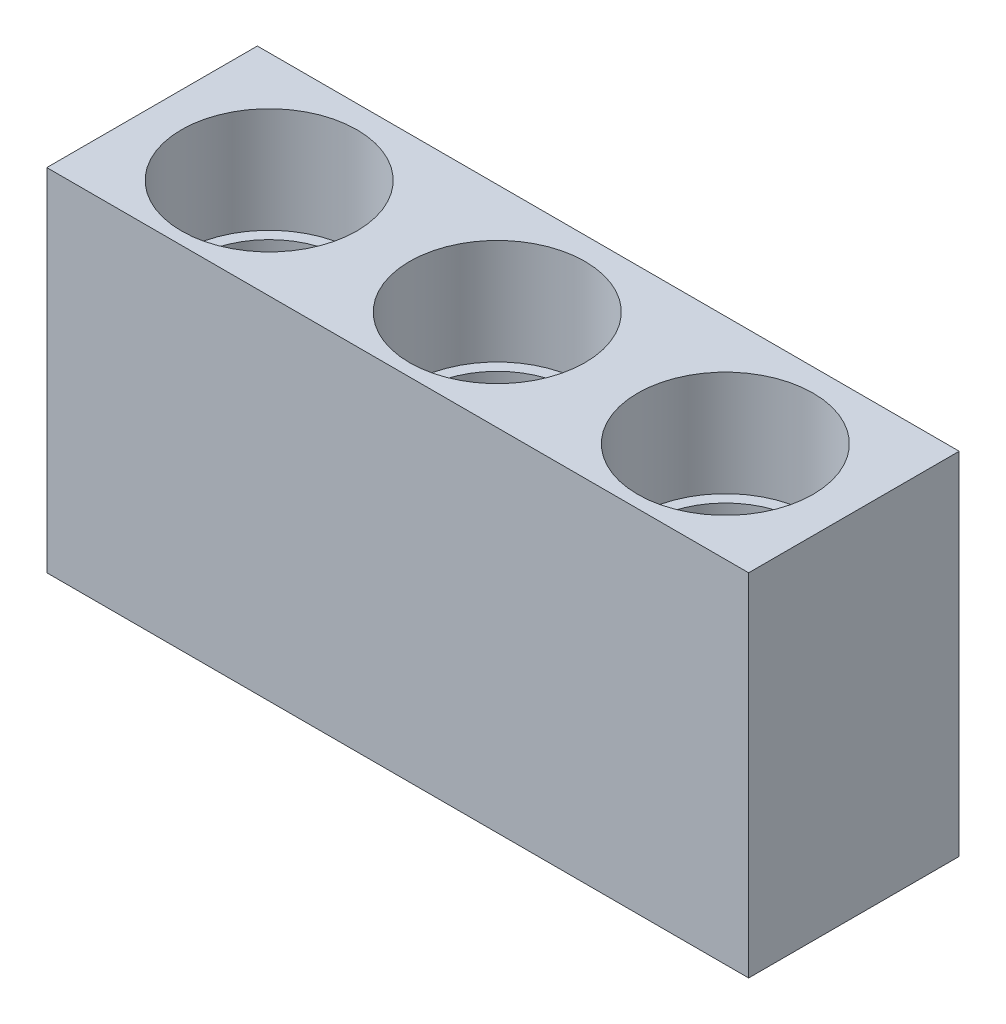
ISO-10303-21;
HEADER;
FILE_DESCRIPTION(('STEP AP214'),'2;1');
FILE_NAME('part.step','',(''),(''),'','','');
FILE_SCHEMA(('AUTOMOTIVE_DESIGN { 1 0 10303 214 1 1 1 1 }'));
ENDSEC;
DATA;
#1=APPLICATION_CONTEXT('core data for automotive mechanical design processes');
#2=APPLICATION_PROTOCOL_DEFINITION('international standard','automotive_design',2000,#1);
#3=PRODUCT_CONTEXT('',#1,'mechanical');
#4=PRODUCT('Part','Part','',(#3));
#5=PRODUCT_RELATED_PRODUCT_CATEGORY('part','',(#4));
#6=PRODUCT_DEFINITION_FORMATION('','',#4);
#7=PRODUCT_DEFINITION_CONTEXT('part definition',#1,'design');
#8=PRODUCT_DEFINITION('design','',#6,#7);
#9=PRODUCT_DEFINITION_SHAPE('','',#8);
#10=(LENGTH_UNIT() NAMED_UNIT(*) SI_UNIT(.MILLI.,.METRE.));
#11=(NAMED_UNIT(*) PLANE_ANGLE_UNIT() SI_UNIT($,.RADIAN.));
#12=(NAMED_UNIT(*) SI_UNIT($,.STERADIAN.) SOLID_ANGLE_UNIT());
#13=UNCERTAINTY_MEASURE_WITH_UNIT(LENGTH_MEASURE(1.E-05),#10,'distance_accuracy_value','');
#14=(GEOMETRIC_REPRESENTATION_CONTEXT(3) GLOBAL_UNCERTAINTY_ASSIGNED_CONTEXT((#13)) GLOBAL_UNIT_ASSIGNED_CONTEXT((#10,
#11,#12)) REPRESENTATION_CONTEXT('',''));
#15=CARTESIAN_POINT('',(0.,0.,0.));
#16=DIRECTION('',(0.,0.,1.));
#17=DIRECTION('',(1.,0.,0.));
#18=AXIS2_PLACEMENT_3D('',#15,#16,#17);
#19=CARTESIAN_POINT('',(6.48366053627173,-3.,-2.85305067871366));
#20=DIRECTION('',(0.,1.,0.));
#21=DIRECTION('',(0.,0.,1.));
#22=AXIS2_PLACEMENT_3D('',#19,#20,#21);
#23=PLANE('',#22);
#24=CARTESIAN_POINT('',(6.48366053627173,-3.,-2.85305067871366));
#25=DIRECTION('',(0.,1.,0.));
#26=DIRECTION('',(0.,0.,1.));
#27=AXIS2_PLACEMENT_3D('',#24,#25,#26);
#28=CIRCLE('',#27,2.175);
#29=CARTESIAN_POINT('',(6.48366053627173,-3.,-0.678050678713657));
#30=VERTEX_POINT('',#29);
#31=EDGE_CURVE('E12',#30,#30,#28,.T.);
#32=ORIENTED_EDGE('',*,*,#31,.T.);
#33=EDGE_LOOP('',(#32));
#34=FACE_BOUND('',#33,.T.);
#35=ADVANCED_FACE('F64',(#34),#23,.T.);
#36=CARTESIAN_POINT('',(6.48366053627173,-3.,-2.85305067871366));
#37=DIRECTION('',(0.,1.,0.));
#38=DIRECTION('',(0.,0.,1.));
#39=AXIS2_PLACEMENT_3D('',#36,#37,#38);
#40=CYLINDRICAL_SURFACE('',#39,2.175);
#41=ORIENTED_EDGE('',*,*,#31,.F.);
#42=EDGE_LOOP('',(#41));
#43=FACE_BOUND('',#42,.T.);
#44=CARTESIAN_POINT('',(6.48366053627173,2.,-2.85305067871366));
#45=DIRECTION('',(0.,1.,0.));
#46=DIRECTION('',(0.,0.,1.));
#47=AXIS2_PLACEMENT_3D('',#44,#45,#46);
#48=CIRCLE('',#47,2.175);
#49=CARTESIAN_POINT('',(6.48366053627173,2.,-0.678050678713657));
#50=VERTEX_POINT('',#49);
#51=EDGE_CURVE('E72',#50,#50,#48,.T.);
#52=ORIENTED_EDGE('',*,*,#51,.T.);
#53=EDGE_LOOP('',(#52));
#54=FACE_BOUND('',#53,.T.);
#55=ADVANCED_FACE('F146',(#43,#54),#40,.F.);
#56=CARTESIAN_POINT('',(6.48366053627173,2.,-2.85305067871366));
#57=DIRECTION('',(0.,1.,0.));
#58=DIRECTION('',(0.,0.,1.));
#59=AXIS2_PLACEMENT_3D('',#56,#57,#58);
#60=PLANE('',#59);
#61=ORIENTED_EDGE('',*,*,#51,.F.);
#62=EDGE_LOOP('',(#61));
#63=FACE_BOUND('',#62,.T.);
#64=CARTESIAN_POINT('',(6.48366053627173,2.,-2.85305067871366));
#65=DIRECTION('',(0.,1.,0.));
#66=DIRECTION('',(0.,0.,1.));
#67=AXIS2_PLACEMENT_3D('',#64,#65,#66);
#68=CIRCLE('',#67,2.5);
#69=CARTESIAN_POINT('',(6.48366053627173,2.,-0.353050678713656));
#70=VERTEX_POINT('',#69);
#71=EDGE_CURVE('E143',#70,#70,#68,.T.);
#72=ORIENTED_EDGE('',*,*,#71,.T.);
#73=EDGE_LOOP('',(#72));
#74=FACE_BOUND('',#73,.T.);
#75=ADVANCED_FACE('F147',(#63,#74),#60,.T.);
#76=CARTESIAN_POINT('',(6.48366053627173,2.,-2.85305067871366));
#77=DIRECTION('',(0.,1.,0.));
#78=DIRECTION('',(0.,0.,1.));
#79=AXIS2_PLACEMENT_3D('',#76,#77,#78);
#80=CYLINDRICAL_SURFACE('',#79,2.5);
#81=ORIENTED_EDGE('',*,*,#71,.F.);
#82=EDGE_LOOP('',(#81));
#83=FACE_BOUND('',#82,.T.);
#84=CARTESIAN_POINT('',(6.48366053627173,5.,-2.85305067871366));
#85=DIRECTION('',(0.,1.,0.));
#86=DIRECTION('',(0.,0.,1.));
#87=AXIS2_PLACEMENT_3D('',#84,#85,#86);
#88=CIRCLE('',#87,2.5);
#89=CARTESIAN_POINT('',(6.48366053627173,5.,-0.353050678713656));
#90=VERTEX_POINT('',#89);
#91=EDGE_CURVE('E132',#90,#90,#88,.T.);
#92=ORIENTED_EDGE('',*,*,#91,.T.);
#93=EDGE_LOOP('',(#92));
#94=FACE_BOUND('',#93,.T.);
#95=ADVANCED_FACE('F153',(#83,#94),#80,.F.);
#96=CARTESIAN_POINT('',(0.,5.,0.));
#97=DIRECTION('',(0.,0.,-1.));
#98=DIRECTION('',(-1.,0.,0.));
#99=AXIS2_PLACEMENT_3D('',#96,#97,#98);
#100=PLANE('',#99);
#101=DIRECTION('',(1.,0.,0.));
#102=VECTOR('',#101,1.);
#103=CARTESIAN_POINT('',(0.,-5.,0.));
#104=LINE('',#103,#102);
#105=CARTESIAN_POINT('',(-10.,-5.,0.));
#106=VERTEX_POINT('',#105);
#107=CARTESIAN_POINT('',(10.,-5.,0.));
#108=VERTEX_POINT('',#107);
#109=EDGE_CURVE('E126',#106,#108,#104,.T.);
#110=ORIENTED_EDGE('',*,*,#109,.T.);
#111=DIRECTION('',(0.,-1.,0.));
#112=VECTOR('',#111,1.);
#113=CARTESIAN_POINT('',(10.,5.,0.));
#114=LINE('',#113,#112);
#115=CARTESIAN_POINT('',(10.,5.,0.));
#116=VERTEX_POINT('',#115);
#117=EDGE_CURVE('E112',#116,#108,#114,.T.);
#118=ORIENTED_EDGE('',*,*,#117,.F.);
#119=DIRECTION('',(1.,0.,0.));
#120=VECTOR('',#119,1.);
#121=CARTESIAN_POINT('',(0.,5.,0.));
#122=LINE('',#121,#120);
#123=CARTESIAN_POINT('',(-10.,5.,0.));
#124=VERTEX_POINT('',#123);
#125=EDGE_CURVE('E119',#124,#116,#122,.T.);
#126=ORIENTED_EDGE('',*,*,#125,.F.);
#127=DIRECTION('',(0.,-1.,0.));
#128=VECTOR('',#127,1.);
#129=CARTESIAN_POINT('',(-10.,5.,0.));
#130=LINE('',#129,#128);
#131=EDGE_CURVE('E105',#124,#106,#130,.T.);
#132=ORIENTED_EDGE('',*,*,#131,.T.);
#133=EDGE_LOOP('',(#110,#118,#126,#132));
#134=FACE_BOUND('',#133,.T.);
#135=ADVANCED_FACE('F127',(#134),#100,.F.);
#136=CARTESIAN_POINT('',(10.,5.,0.));
#137=DIRECTION('',(-1.,0.,0.));
#138=DIRECTION('',(0.,0.,1.));
#139=AXIS2_PLACEMENT_3D('',#136,#137,#138);
#140=PLANE('',#139);
#141=DIRECTION('',(0.,0.,-1.));
#142=VECTOR('',#141,1.);
#143=CARTESIAN_POINT('',(10.,-5.,0.));
#144=LINE('',#143,#142);
#145=CARTESIAN_POINT('',(10.,-5.,-6.));
#146=VERTEX_POINT('',#145);
#147=EDGE_CURVE('E201',#108,#146,#144,.T.);
#148=ORIENTED_EDGE('',*,*,#147,.T.);
#149=DIRECTION('',(0.,-1.,0.));
#150=VECTOR('',#149,1.);
#151=CARTESIAN_POINT('',(10.,5.,-6.));
#152=LINE('',#151,#150);
#153=CARTESIAN_POINT('',(10.,5.,-6.));
#154=VERTEX_POINT('',#153);
#155=EDGE_CURVE('E94',#154,#146,#152,.T.);
#156=ORIENTED_EDGE('',*,*,#155,.F.);
#157=DIRECTION('',(0.,0.,-1.));
#158=VECTOR('',#157,1.);
#159=CARTESIAN_POINT('',(10.,5.,0.));
#160=LINE('',#159,#158);
#161=EDGE_CURVE('E110',#116,#154,#160,.T.);
#162=ORIENTED_EDGE('',*,*,#161,.F.);
#163=ORIENTED_EDGE('',*,*,#117,.T.);
#164=EDGE_LOOP('',(#148,#156,#162,#163));
#165=FACE_BOUND('',#164,.T.);
#166=ADVANCED_FACE('F108',(#165),#140,.F.);
#167=CARTESIAN_POINT('',(0.,5.,-6.));
#168=DIRECTION('',(0.,0.,-1.));
#169=DIRECTION('',(-1.,0.,0.));
#170=AXIS2_PLACEMENT_3D('',#167,#168,#169);
#171=PLANE('',#170);
#172=DIRECTION('',(1.,0.,0.));
#173=VECTOR('',#172,1.);
#174=CARTESIAN_POINT('',(0.,-5.,-6.));
#175=LINE('',#174,#173);
#176=CARTESIAN_POINT('',(-10.,-5.,-6.));
#177=VERTEX_POINT('',#176);
#178=EDGE_CURVE('E203',#177,#146,#175,.T.);
#179=ORIENTED_EDGE('',*,*,#178,.F.);
#180=DIRECTION('',(0.,-1.,0.));
#181=VECTOR('',#180,1.);
#182=CARTESIAN_POINT('',(-10.,5.,-6.));
#183=LINE('',#182,#181);
#184=CARTESIAN_POINT('',(-10.,5.,-6.));
#185=VERTEX_POINT('',#184);
#186=EDGE_CURVE('E80',#185,#177,#183,.T.);
#187=ORIENTED_EDGE('',*,*,#186,.F.);
#188=DIRECTION('',(1.,0.,0.));
#189=VECTOR('',#188,1.);
#190=CARTESIAN_POINT('',(0.,5.,-6.));
#191=LINE('',#190,#189);
#192=EDGE_CURVE('E118',#185,#154,#191,.T.);
#193=ORIENTED_EDGE('',*,*,#192,.T.);
#194=ORIENTED_EDGE('',*,*,#155,.T.);
#195=EDGE_LOOP('',(#179,#187,#193,#194));
#196=FACE_BOUND('',#195,.T.);
#197=ADVANCED_FACE('F195',(#196),#171,.T.);
#198=CARTESIAN_POINT('',(-10.,5.,0.));
#199=DIRECTION('',(-1.,0.,0.));
#200=DIRECTION('',(0.,0.,1.));
#201=AXIS2_PLACEMENT_3D('',#198,#199,#200);
#202=PLANE('',#201);
#203=DIRECTION('',(0.,0.,-1.));
#204=VECTOR('',#203,1.);
#205=CARTESIAN_POINT('',(-10.,-5.,0.));
#206=LINE('',#205,#204);
#207=EDGE_CURVE('E212',#106,#177,#206,.T.);
#208=ORIENTED_EDGE('',*,*,#207,.F.);
#209=ORIENTED_EDGE('',*,*,#131,.F.);
#210=DIRECTION('',(0.,0.,-1.));
#211=VECTOR('',#210,1.);
#212=CARTESIAN_POINT('',(-10.,5.,0.));
#213=LINE('',#212,#211);
#214=EDGE_CURVE('E125',#124,#185,#213,.T.);
#215=ORIENTED_EDGE('',*,*,#214,.T.);
#216=ORIENTED_EDGE('',*,*,#186,.T.);
#217=EDGE_LOOP('',(#208,#209,#215,#216));
#218=FACE_BOUND('',#217,.T.);
#219=ADVANCED_FACE('F175',(#218),#202,.T.);
#220=CARTESIAN_POINT('',(0.,-5.,0.));
#221=DIRECTION('',(0.,1.,0.));
#222=DIRECTION('',(0.,0.,1.));
#223=AXIS2_PLACEMENT_3D('',#220,#221,#222);
#224=PLANE('',#223);
#225=ORIENTED_EDGE('',*,*,#207,.T.);
#226=ORIENTED_EDGE('',*,*,#178,.T.);
#227=ORIENTED_EDGE('',*,*,#147,.F.);
#228=ORIENTED_EDGE('',*,*,#109,.F.);
#229=EDGE_LOOP('',(#225,#226,#227,#228));
#230=FACE_BOUND('',#229,.T.);
#231=ADVANCED_FACE('F162',(#230),#224,.F.);
#232=CARTESIAN_POINT('',(0.,5.,0.));
#233=DIRECTION('',(0.,1.,0.));
#234=DIRECTION('',(0.,0.,1.));
#235=AXIS2_PLACEMENT_3D('',#232,#233,#234);
#236=PLANE('',#235);
#237=CARTESIAN_POINT('',(-0.0163394637282674,5.,-2.85305067871366));
#238=DIRECTION('',(0.,1.,0.));
#239=DIRECTION('',(0.,0.,1.));
#240=AXIS2_PLACEMENT_3D('',#237,#238,#239);
#241=CIRCLE('',#240,2.5);
#242=CARTESIAN_POINT('',(-0.0163394637282674,5.,-0.353050678713656));
#243=VERTEX_POINT('',#242);
#244=EDGE_CURVE('E241',#243,#243,#241,.T.);
#245=ORIENTED_EDGE('',*,*,#244,.F.);
#246=EDGE_LOOP('',(#245));
#247=FACE_BOUND('',#246,.T.);
#248=CARTESIAN_POINT('',(-6.51633946372827,5.,-2.85305067871366));
#249=DIRECTION('',(0.,1.,0.));
#250=DIRECTION('',(0.,0.,1.));
#251=AXIS2_PLACEMENT_3D('',#248,#249,#250);
#252=CIRCLE('',#251,2.5);
#253=CARTESIAN_POINT('',(-6.51633946372827,5.,-0.353050678713656));
#254=VERTEX_POINT('',#253);
#255=EDGE_CURVE('E222',#254,#254,#252,.T.);
#256=ORIENTED_EDGE('',*,*,#255,.F.);
#257=EDGE_LOOP('',(#256));
#258=FACE_BOUND('',#257,.T.);
#259=ORIENTED_EDGE('',*,*,#214,.F.);
#260=ORIENTED_EDGE('',*,*,#125,.T.);
#261=ORIENTED_EDGE('',*,*,#161,.T.);
#262=ORIENTED_EDGE('',*,*,#192,.F.);
#263=EDGE_LOOP('',(#259,#260,#261,#262));
#264=FACE_BOUND('',#263,.T.);
#265=ORIENTED_EDGE('',*,*,#91,.F.);
#266=EDGE_LOOP('',(#265));
#267=FACE_BOUND('',#266,.T.);
#268=ADVANCED_FACE('F116',(#247,#258,#264,#267),#236,.T.);
#269=CARTESIAN_POINT('',(-6.51633946372827,2.,-2.85305067871366));
#270=DIRECTION('',(0.,1.,0.));
#271=DIRECTION('',(0.,0.,1.));
#272=AXIS2_PLACEMENT_3D('',#269,#270,#271);
#273=CYLINDRICAL_SURFACE('',#272,2.5);
#274=CARTESIAN_POINT('',(-6.51633946372827,2.,-2.85305067871366));
#275=DIRECTION('',(0.,1.,0.));
#276=DIRECTION('',(0.,0.,1.));
#277=AXIS2_PLACEMENT_3D('',#274,#275,#276);
#278=CIRCLE('',#277,2.5);
#279=CARTESIAN_POINT('',(-6.51633946372827,2.,-0.353050678713656));
#280=VERTEX_POINT('',#279);
#281=EDGE_CURVE('E216',#280,#280,#278,.T.);
#282=ORIENTED_EDGE('',*,*,#281,.F.);
#283=EDGE_LOOP('',(#282));
#284=FACE_BOUND('',#283,.T.);
#285=ORIENTED_EDGE('',*,*,#255,.T.);
#286=EDGE_LOOP('',(#285));
#287=FACE_BOUND('',#286,.T.);
#288=ADVANCED_FACE('F165',(#284,#287),#273,.F.);
#289=CARTESIAN_POINT('',(-6.51633946372827,2.,-2.85305067871366));
#290=DIRECTION('',(0.,1.,0.));
#291=DIRECTION('',(0.,0.,1.));
#292=AXIS2_PLACEMENT_3D('',#289,#290,#291);
#293=PLANE('',#292);
#294=CARTESIAN_POINT('',(-6.51633946372827,2.,-2.85305067871366));
#295=DIRECTION('',(0.,1.,0.));
#296=DIRECTION('',(0.,0.,1.));
#297=AXIS2_PLACEMENT_3D('',#294,#295,#296);
#298=CIRCLE('',#297,2.175);
#299=CARTESIAN_POINT('',(-6.51633946372827,2.,-0.678050678713657));
#300=VERTEX_POINT('',#299);
#301=EDGE_CURVE('E230',#300,#300,#298,.T.);
#302=ORIENTED_EDGE('',*,*,#301,.F.);
#303=EDGE_LOOP('',(#302));
#304=FACE_BOUND('',#303,.T.);
#305=ORIENTED_EDGE('',*,*,#281,.T.);
#306=EDGE_LOOP('',(#305));
#307=FACE_BOUND('',#306,.T.);
#308=ADVANCED_FACE('F168',(#304,#307),#293,.T.);
#309=CARTESIAN_POINT('',(-6.51633946372827,-3.,-2.85305067871366));
#310=DIRECTION('',(0.,1.,0.));
#311=DIRECTION('',(0.,0.,1.));
#312=AXIS2_PLACEMENT_3D('',#309,#310,#311);
#313=CYLINDRICAL_SURFACE('',#312,2.175);
#314=CARTESIAN_POINT('',(-6.51633946372827,-3.,-2.85305067871366));
#315=DIRECTION('',(0.,1.,0.));
#316=DIRECTION('',(0.,0.,1.));
#317=AXIS2_PLACEMENT_3D('',#314,#315,#316);
#318=CIRCLE('',#317,2.175);
#319=CARTESIAN_POINT('',(-6.51633946372827,-3.,-0.678050678713657));
#320=VERTEX_POINT('',#319);
#321=EDGE_CURVE('E223',#320,#320,#318,.T.);
#322=ORIENTED_EDGE('',*,*,#321,.F.);
#323=EDGE_LOOP('',(#322));
#324=FACE_BOUND('',#323,.T.);
#325=ORIENTED_EDGE('',*,*,#301,.T.);
#326=EDGE_LOOP('',(#325));
#327=FACE_BOUND('',#326,.T.);
#328=ADVANCED_FACE('F261',(#324,#327),#313,.F.);
#329=CARTESIAN_POINT('',(-6.51633946372827,-3.,-2.85305067871366));
#330=DIRECTION('',(0.,1.,0.));
#331=DIRECTION('',(0.,0.,1.));
#332=AXIS2_PLACEMENT_3D('',#329,#330,#331);
#333=PLANE('',#332);
#334=ORIENTED_EDGE('',*,*,#321,.T.);
#335=EDGE_LOOP('',(#334));
#336=FACE_BOUND('',#335,.T.);
#337=ADVANCED_FACE('F252',(#336),#333,.T.);
#338=CARTESIAN_POINT('',(-0.0163394637282674,2.,-2.85305067871366));
#339=DIRECTION('',(0.,1.,0.));
#340=DIRECTION('',(0.,0.,1.));
#341=AXIS2_PLACEMENT_3D('',#338,#339,#340);
#342=CYLINDRICAL_SURFACE('',#341,2.5);
#343=CARTESIAN_POINT('',(-0.0163394637282674,2.,-2.85305067871366));
#344=DIRECTION('',(0.,1.,0.));
#345=DIRECTION('',(0.,0.,1.));
#346=AXIS2_PLACEMENT_3D('',#343,#344,#345);
#347=CIRCLE('',#346,2.5);
#348=CARTESIAN_POINT('',(-0.0163394637282674,2.,-0.353050678713656));
#349=VERTEX_POINT('',#348);
#350=EDGE_CURVE('E233',#349,#349,#347,.T.);
#351=ORIENTED_EDGE('',*,*,#350,.F.);
#352=EDGE_LOOP('',(#351));
#353=FACE_BOUND('',#352,.T.);
#354=ORIENTED_EDGE('',*,*,#244,.T.);
#355=EDGE_LOOP('',(#354));
#356=FACE_BOUND('',#355,.T.);
#357=ADVANCED_FACE('F249',(#353,#356),#342,.F.);
#358=CARTESIAN_POINT('',(-0.0163394637282674,2.,-2.85305067871366));
#359=DIRECTION('',(0.,1.,0.));
#360=DIRECTION('',(0.,0.,1.));
#361=AXIS2_PLACEMENT_3D('',#358,#359,#360);
#362=PLANE('',#361);
#363=CARTESIAN_POINT('',(-0.0163394637282674,2.,-2.85305067871366));
#364=DIRECTION('',(0.,1.,0.));
#365=DIRECTION('',(0.,0.,1.));
#366=AXIS2_PLACEMENT_3D('',#363,#364,#365);
#367=CIRCLE('',#366,2.175);
#368=CARTESIAN_POINT('',(-0.0163394637282674,2.,-0.678050678713657));
#369=VERTEX_POINT('',#368);
#370=EDGE_CURVE('E240',#369,#369,#367,.T.);
#371=ORIENTED_EDGE('',*,*,#370,.F.);
#372=EDGE_LOOP('',(#371));
#373=FACE_BOUND('',#372,.T.);
#374=ORIENTED_EDGE('',*,*,#350,.T.);
#375=EDGE_LOOP('',(#374));
#376=FACE_BOUND('',#375,.T.);
#377=ADVANCED_FACE('F253',(#373,#376),#362,.T.);
#378=CARTESIAN_POINT('',(-0.0163394637282674,-3.,-2.85305067871366));
#379=DIRECTION('',(0.,1.,0.));
#380=DIRECTION('',(0.,0.,1.));
#381=AXIS2_PLACEMENT_3D('',#378,#379,#380);
#382=CYLINDRICAL_SURFACE('',#381,2.175);
#383=CARTESIAN_POINT('',(-0.0163394637282674,-3.,-2.85305067871366));
#384=DIRECTION('',(0.,1.,0.));
#385=DIRECTION('',(0.,0.,1.));
#386=AXIS2_PLACEMENT_3D('',#383,#384,#385);
#387=CIRCLE('',#386,2.175);
#388=CARTESIAN_POINT('',(-0.0163394637282674,-3.,-0.678050678713657));
#389=VERTEX_POINT('',#388);
#390=EDGE_CURVE('E243',#389,#389,#387,.T.);
#391=ORIENTED_EDGE('',*,*,#390,.F.);
#392=EDGE_LOOP('',(#391));
#393=FACE_BOUND('',#392,.T.);
#394=ORIENTED_EDGE('',*,*,#370,.T.);
#395=EDGE_LOOP('',(#394));
#396=FACE_BOUND('',#395,.T.);
#397=ADVANCED_FACE('F256',(#393,#396),#382,.F.);
#398=CARTESIAN_POINT('',(-0.0163394637282674,-3.,-2.85305067871366));
#399=DIRECTION('',(0.,1.,0.));
#400=DIRECTION('',(0.,0.,1.));
#401=AXIS2_PLACEMENT_3D('',#398,#399,#400);
#402=PLANE('',#401);
#403=ORIENTED_EDGE('',*,*,#390,.T.);
#404=EDGE_LOOP('',(#403));
#405=FACE_BOUND('',#404,.T.);
#406=ADVANCED_FACE('F334',(#405),#402,.T.);
#407=CLOSED_SHELL('',(#35,#55,#75,#95,#135,#166,#197,#219,#231,#268,#288,#308,#328,#337,#357,
#377,#397,#406));
#408=MANIFOLD_SOLID_BREP('B2',#407);
#409=ADVANCED_BREP_SHAPE_REPRESENTATION('',(#18,#408),#14);
#410=SHAPE_DEFINITION_REPRESENTATION(#9,#409);
ENDSEC;
END-ISO-10303-21;
